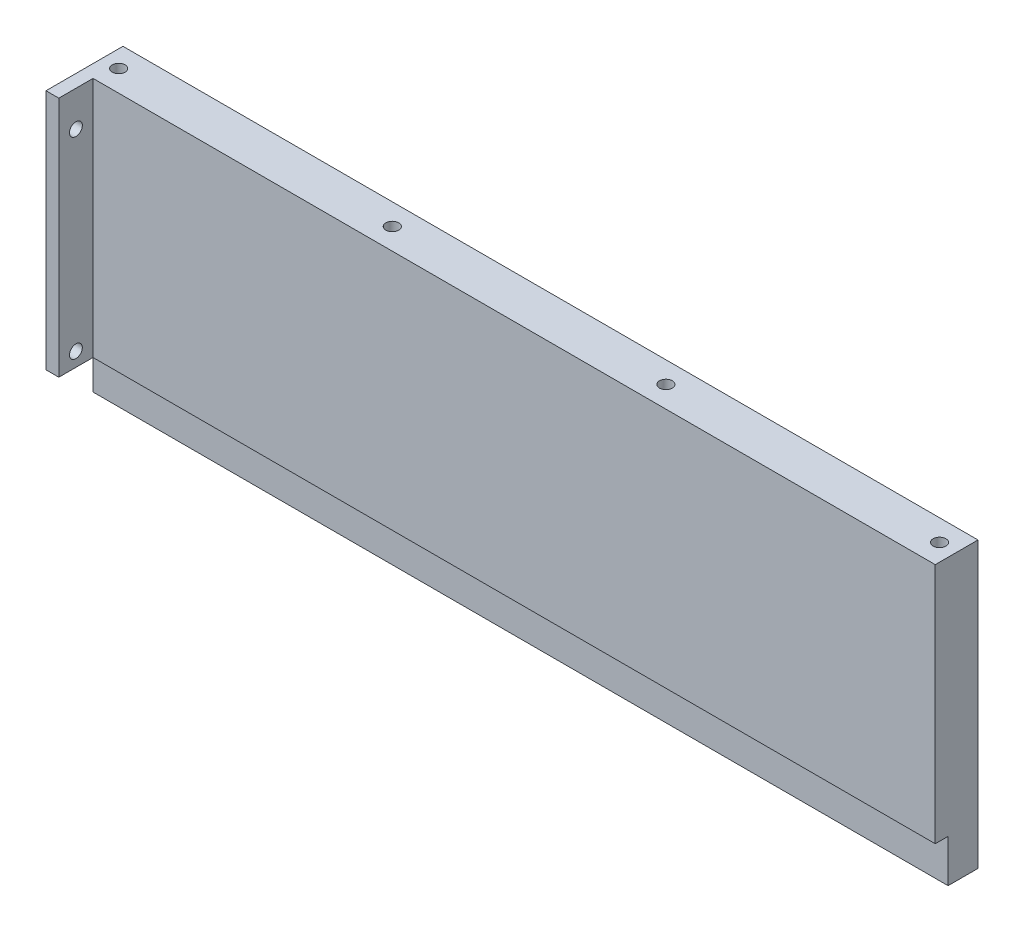
ISO-10303-21;
HEADER;
FILE_DESCRIPTION(('STEP AP214'),'2;1');
FILE_NAME('part.step','',(''),(''),'','','');
FILE_SCHEMA(('AUTOMOTIVE_DESIGN { 1 0 10303 214 1 1 1 1 }'));
ENDSEC;
DATA;
#1=APPLICATION_CONTEXT('core data for automotive mechanical design processes');
#2=APPLICATION_PROTOCOL_DEFINITION('international standard','automotive_design',2000,#1);
#3=PRODUCT_CONTEXT('',#1,'mechanical');
#4=PRODUCT('Part','Part','',(#3));
#5=PRODUCT_RELATED_PRODUCT_CATEGORY('part','',(#4));
#6=PRODUCT_DEFINITION_FORMATION('','',#4);
#7=PRODUCT_DEFINITION_CONTEXT('part definition',#1,'design');
#8=PRODUCT_DEFINITION('design','',#6,#7);
#9=PRODUCT_DEFINITION_SHAPE('','',#8);
#10=(LENGTH_UNIT() NAMED_UNIT(*) SI_UNIT(.MILLI.,.METRE.));
#11=(NAMED_UNIT(*) PLANE_ANGLE_UNIT() SI_UNIT($,.RADIAN.));
#12=(NAMED_UNIT(*) SI_UNIT($,.STERADIAN.) SOLID_ANGLE_UNIT());
#13=UNCERTAINTY_MEASURE_WITH_UNIT(LENGTH_MEASURE(1.E-05),#10,'distance_accuracy_value','');
#14=(GEOMETRIC_REPRESENTATION_CONTEXT(3) GLOBAL_UNCERTAINTY_ASSIGNED_CONTEXT((#13)) GLOBAL_UNIT_ASSIGNED_CONTEXT((#10,
#11,#12)) REPRESENTATION_CONTEXT('',''));
#15=CARTESIAN_POINT('',(0.,0.,0.));
#16=DIRECTION('',(0.,0.,1.));
#17=DIRECTION('',(1.,0.,0.));
#18=AXIS2_PLACEMENT_3D('',#15,#16,#17);
#19=CARTESIAN_POINT('',(-100.,66.54,5.));
#20=DIRECTION('',(0.,0.,-1.));
#21=DIRECTION('',(-1.,0.,0.));
#22=AXIS2_PLACEMENT_3D('',#19,#20,#21);
#23=PLANE('',#22);
#24=DIRECTION('',(0.,1.,0.));
#25=VECTOR('',#24,1.);
#26=CARTESIAN_POINT('',(-97.0000000000001,66.54,5.));
#27=LINE('',#26,#25);
#28=CARTESIAN_POINT('',(-97.0000000000001,10.,5.));
#29=VERTEX_POINT('',#28);
#30=CARTESIAN_POINT('',(-97.0000000000001,66.54,5.));
#31=VERTEX_POINT('',#30);
#32=EDGE_CURVE('E59',#29,#31,#27,.T.);
#33=ORIENTED_EDGE('',*,*,#32,.F.);
#34=DIRECTION('',(-1.,0.,0.));
#35=VECTOR('',#34,1.);
#36=CARTESIAN_POINT('',(-100.,10.,5.));
#37=LINE('',#36,#35);
#38=CARTESIAN_POINT('',(99.9999999999999,10.,5.));
#39=VERTEX_POINT('',#38);
#40=EDGE_CURVE('E156',#39,#29,#37,.T.);
#41=ORIENTED_EDGE('',*,*,#40,.F.);
#42=DIRECTION('',(0.,-1.,0.));
#43=VECTOR('',#42,1.);
#44=CARTESIAN_POINT('',(99.9999999999999,66.54,5.));
#45=LINE('',#44,#43);
#46=CARTESIAN_POINT('',(99.9999999999999,66.54,5.));
#47=VERTEX_POINT('',#46);
#48=EDGE_CURVE('E202',#47,#39,#45,.T.);
#49=ORIENTED_EDGE('',*,*,#48,.F.);
#50=DIRECTION('',(1.,0.,0.));
#51=VECTOR('',#50,1.);
#52=CARTESIAN_POINT('',(-100.,66.54,5.));
#53=LINE('',#52,#51);
#54=EDGE_CURVE('E199',#31,#47,#53,.T.);
#55=ORIENTED_EDGE('',*,*,#54,.F.);
#56=EDGE_LOOP('',(#33,#41,#49,#55));
#57=FACE_BOUND('',#56,.T.);
#58=ADVANCED_FACE('F43',(#57),#23,.F.);
#59=CARTESIAN_POINT('',(95.9999999999999,-0.001000000000001,0.));
#60=DIRECTION('',(0.,1.,0.));
#61=DIRECTION('',(0.,0.,1.));
#62=AXIS2_PLACEMENT_3D('',#59,#60,#61);
#63=CYLINDRICAL_SURFACE('',#62,1.5);
#64=CARTESIAN_POINT('',(95.9999999999999,0.,0.));
#65=DIRECTION('',(0.,-1.,0.));
#66=DIRECTION('',(0.,0.,-1.));
#67=AXIS2_PLACEMENT_3D('',#64,#65,#66);
#68=CIRCLE('',#67,1.5);
#69=CARTESIAN_POINT('',(95.9999999999999,0.,-1.5));
#70=VERTEX_POINT('',#69);
#71=EDGE_CURVE('E52',#70,#70,#68,.F.);
#72=ORIENTED_EDGE('',*,*,#71,.F.);
#73=EDGE_LOOP('',(#72));
#74=FACE_BOUND('',#73,.T.);
#75=CARTESIAN_POINT('',(95.9999999999999,66.54,0.));
#76=DIRECTION('',(0.,1.,0.));
#77=DIRECTION('',(0.,0.,1.));
#78=AXIS2_PLACEMENT_3D('',#75,#76,#77);
#79=CIRCLE('',#78,1.5);
#80=CARTESIAN_POINT('',(95.9999999999999,66.54,1.5));
#81=VERTEX_POINT('',#80);
#82=EDGE_CURVE('E11',#81,#81,#79,.T.);
#83=ORIENTED_EDGE('',*,*,#82,.T.);
#84=EDGE_LOOP('',(#83));
#85=FACE_BOUND('',#84,.T.);
#86=ADVANCED_FACE('F45',(#74,#85),#63,.F.);
#87=CARTESIAN_POINT('',(31.9999999999999,-0.001000000000001,0.));
#88=DIRECTION('',(0.,1.,0.));
#89=DIRECTION('',(0.,0.,1.));
#90=AXIS2_PLACEMENT_3D('',#87,#88,#89);
#91=CYLINDRICAL_SURFACE('',#90,1.5);
#92=CARTESIAN_POINT('',(31.9999999999999,0.,0.));
#93=DIRECTION('',(0.,-1.,0.));
#94=DIRECTION('',(0.,0.,-1.));
#95=AXIS2_PLACEMENT_3D('',#92,#93,#94);
#96=CIRCLE('',#95,1.5);
#97=CARTESIAN_POINT('',(31.9999999999999,0.,-1.5));
#98=VERTEX_POINT('',#97);
#99=EDGE_CURVE('E221',#98,#98,#96,.F.);
#100=ORIENTED_EDGE('',*,*,#99,.F.);
#101=EDGE_LOOP('',(#100));
#102=FACE_BOUND('',#101,.T.);
#103=CARTESIAN_POINT('',(31.9999999999999,66.54,0.));
#104=DIRECTION('',(0.,1.,0.));
#105=DIRECTION('',(0.,0.,1.));
#106=AXIS2_PLACEMENT_3D('',#103,#104,#105);
#107=CIRCLE('',#106,1.5);
#108=CARTESIAN_POINT('',(31.9999999999999,66.54,1.5));
#109=VERTEX_POINT('',#108);
#110=EDGE_CURVE('E225',#109,#109,#107,.T.);
#111=ORIENTED_EDGE('',*,*,#110,.T.);
#112=EDGE_LOOP('',(#111));
#113=FACE_BOUND('',#112,.T.);
#114=ADVANCED_FACE('F236',(#102,#113),#91,.F.);
#115=CARTESIAN_POINT('',(99.9999999999999,66.54,5.));
#116=DIRECTION('',(-1.,0.,0.));
#117=DIRECTION('',(0.,0.,1.));
#118=AXIS2_PLACEMENT_3D('',#115,#116,#117);
#119=PLANE('',#118);
#120=ORIENTED_EDGE('',*,*,#48,.T.);
#121=DIRECTION('',(0.,0.,1.));
#122=VECTOR('',#121,1.);
#123=CARTESIAN_POINT('',(99.9999999999999,10.,2.));
#124=LINE('',#123,#122);
#125=CARTESIAN_POINT('',(99.9999999999999,10.,2.));
#126=VERTEX_POINT('',#125);
#127=EDGE_CURVE('E121',#126,#39,#124,.T.);
#128=ORIENTED_EDGE('',*,*,#127,.F.);
#129=DIRECTION('',(0.,1.,0.));
#130=VECTOR('',#129,1.);
#131=CARTESIAN_POINT('',(99.9999999999999,0.,2.));
#132=LINE('',#131,#130);
#133=CARTESIAN_POINT('',(99.9999999999999,0.,2.));
#134=VERTEX_POINT('',#133);
#135=EDGE_CURVE('E162',#134,#126,#132,.T.);
#136=ORIENTED_EDGE('',*,*,#135,.F.);
#137=DIRECTION('',(0.,0.,-1.));
#138=VECTOR('',#137,1.);
#139=CARTESIAN_POINT('',(99.9999999999999,0.,5.));
#140=LINE('',#139,#138);
#141=CARTESIAN_POINT('',(99.9999999999999,0.,-5.));
#142=VERTEX_POINT('',#141);
#143=EDGE_CURVE('E184',#134,#142,#140,.T.);
#144=ORIENTED_EDGE('',*,*,#143,.T.);
#145=DIRECTION('',(0.,-1.,0.));
#146=VECTOR('',#145,1.);
#147=CARTESIAN_POINT('',(99.9999999999999,66.54,-5.));
#148=LINE('',#147,#146);
#149=CARTESIAN_POINT('',(99.9999999999999,66.54,-5.));
#150=VERTEX_POINT('',#149);
#151=EDGE_CURVE('E217',#150,#142,#148,.T.);
#152=ORIENTED_EDGE('',*,*,#151,.F.);
#153=DIRECTION('',(0.,0.,-1.));
#154=VECTOR('',#153,1.);
#155=CARTESIAN_POINT('',(99.9999999999999,66.54,5.));
#156=LINE('',#155,#154);
#157=EDGE_CURVE('E188',#47,#150,#156,.T.);
#158=ORIENTED_EDGE('',*,*,#157,.F.);
#159=EDGE_LOOP('',(#120,#128,#136,#144,#152,#158));
#160=FACE_BOUND('',#159,.T.);
#161=ADVANCED_FACE('F263',(#160),#119,.F.);
#162=CARTESIAN_POINT('',(-100.,66.54,-5.));
#163=DIRECTION('',(0.,0.,1.));
#164=DIRECTION('',(1.,0.,0.));
#165=AXIS2_PLACEMENT_3D('',#162,#163,#164);
#166=PLANE('',#165);
#167=DIRECTION('',(-1.,0.,0.));
#168=VECTOR('',#167,1.);
#169=CARTESIAN_POINT('',(-100.,0.,-5.));
#170=LINE('',#169,#168);
#171=CARTESIAN_POINT('',(-100.,0.,-5.));
#172=VERTEX_POINT('',#171);
#173=EDGE_CURVE('E205',#142,#172,#170,.T.);
#174=ORIENTED_EDGE('',*,*,#173,.T.);
#175=DIRECTION('',(0.,-1.,0.));
#176=VECTOR('',#175,1.);
#177=CARTESIAN_POINT('',(-100.,66.54,-5.));
#178=LINE('',#177,#176);
#179=CARTESIAN_POINT('',(-100.,66.54,-5.));
#180=VERTEX_POINT('',#179);
#181=EDGE_CURVE('E213',#180,#172,#178,.T.);
#182=ORIENTED_EDGE('',*,*,#181,.F.);
#183=DIRECTION('',(-1.,0.,0.));
#184=VECTOR('',#183,1.);
#185=CARTESIAN_POINT('',(-100.,66.54,-5.));
#186=LINE('',#185,#184);
#187=EDGE_CURVE('E192',#150,#180,#186,.T.);
#188=ORIENTED_EDGE('',*,*,#187,.F.);
#189=ORIENTED_EDGE('',*,*,#151,.T.);
#190=EDGE_LOOP('',(#174,#182,#188,#189));
#191=FACE_BOUND('',#190,.T.);
#192=ADVANCED_FACE('F250',(#191),#166,.F.);
#193=CARTESIAN_POINT('',(-100.,66.54,5.));
#194=DIRECTION('',(1.,0.,0.));
#195=DIRECTION('',(0.,0.,-1.));
#196=AXIS2_PLACEMENT_3D('',#193,#194,#195);
#197=PLANE('',#196);
#198=CARTESIAN_POINT('',(-100.,58.27,9.));
#199=DIRECTION('',(-1.,0.,0.));
#200=DIRECTION('',(0.,0.,1.));
#201=AXIS2_PLACEMENT_3D('',#198,#199,#200);
#202=CIRCLE('',#201,1.5);
#203=CARTESIAN_POINT('',(-100.,58.27,10.5));
#204=VERTEX_POINT('',#203);
#205=EDGE_CURVE('E454',#204,#204,#202,.T.);
#206=ORIENTED_EDGE('',*,*,#205,.F.);
#207=EDGE_LOOP('',(#206));
#208=FACE_BOUND('',#207,.T.);
#209=CARTESIAN_POINT('',(-100.,13.27,9.));
#210=DIRECTION('',(-1.,0.,0.));
#211=DIRECTION('',(0.,0.,1.));
#212=AXIS2_PLACEMENT_3D('',#209,#210,#211);
#213=CIRCLE('',#212,1.5);
#214=CARTESIAN_POINT('',(-100.,13.27,10.5));
#215=VERTEX_POINT('',#214);
#216=EDGE_CURVE('E143',#215,#215,#213,.T.);
#217=ORIENTED_EDGE('',*,*,#216,.F.);
#218=EDGE_LOOP('',(#217));
#219=FACE_BOUND('',#218,.T.);
#220=DIRECTION('',(0.,-1.,0.));
#221=VECTOR('',#220,1.);
#222=CARTESIAN_POINT('',(-100.,0.,2.));
#223=LINE('',#222,#221);
#224=CARTESIAN_POINT('',(-100.,10.,2.));
#225=VERTEX_POINT('',#224);
#226=CARTESIAN_POINT('',(-100.,0.,2.));
#227=VERTEX_POINT('',#226);
#228=EDGE_CURVE('E67',#225,#227,#223,.T.);
#229=ORIENTED_EDGE('',*,*,#228,.F.);
#230=DIRECTION('',(0.,0.,1.));
#231=VECTOR('',#230,1.);
#232=CARTESIAN_POINT('',(-100.,10.,2.));
#233=LINE('',#232,#231);
#234=CARTESIAN_POINT('',(-100.,10.,13.));
#235=VERTEX_POINT('',#234);
#236=EDGE_CURVE('E110',#225,#235,#233,.T.);
#237=ORIENTED_EDGE('',*,*,#236,.T.);
#238=DIRECTION('',(0.,-1.,0.));
#239=VECTOR('',#238,1.);
#240=CARTESIAN_POINT('',(-100.,66.54,13.));
#241=LINE('',#240,#239);
#242=CARTESIAN_POINT('',(-100.,66.54,13.));
#243=VERTEX_POINT('',#242);
#244=EDGE_CURVE('E115',#243,#235,#241,.T.);
#245=ORIENTED_EDGE('',*,*,#244,.F.);
#246=DIRECTION('',(0.,0.,1.));
#247=VECTOR('',#246,1.);
#248=CARTESIAN_POINT('',(-100.,66.54,5.));
#249=LINE('',#248,#247);
#250=EDGE_CURVE('E196',#180,#243,#249,.T.);
#251=ORIENTED_EDGE('',*,*,#250,.F.);
#252=ORIENTED_EDGE('',*,*,#181,.T.);
#253=DIRECTION('',(0.,0.,1.));
#254=VECTOR('',#253,1.);
#255=CARTESIAN_POINT('',(-100.,0.,5.));
#256=LINE('',#255,#254);
#257=EDGE_CURVE('E193',#172,#227,#256,.T.);
#258=ORIENTED_EDGE('',*,*,#257,.T.);
#259=EDGE_LOOP('',(#229,#237,#245,#251,#252,#258));
#260=FACE_BOUND('',#259,.T.);
#261=ADVANCED_FACE('F112',(#208,#219,#260),#197,.F.);
#262=CARTESIAN_POINT('',(0.,66.54,0.));
#263=DIRECTION('',(0.,-1.,0.));
#264=DIRECTION('',(0.,0.,-1.));
#265=AXIS2_PLACEMENT_3D('',#262,#263,#264);
#266=PLANE('',#265);
#267=CARTESIAN_POINT('',(-32.0000000000001,66.54,0.));
#268=DIRECTION('',(0.,1.,0.));
#269=DIRECTION('',(0.,0.,1.));
#270=AXIS2_PLACEMENT_3D('',#267,#268,#269);
#271=CIRCLE('',#270,1.5);
#272=CARTESIAN_POINT('',(-32.0000000000001,66.54,1.5));
#273=VERTEX_POINT('',#272);
#274=EDGE_CURVE('E175',#273,#273,#271,.T.);
#275=ORIENTED_EDGE('',*,*,#274,.F.);
#276=EDGE_LOOP('',(#275));
#277=FACE_BOUND('',#276,.T.);
#278=CARTESIAN_POINT('',(-96.0000000000001,66.54,0.));
#279=DIRECTION('',(0.,1.,0.));
#280=DIRECTION('',(0.,0.,1.));
#281=AXIS2_PLACEMENT_3D('',#278,#279,#280);
#282=CIRCLE('',#281,1.5);
#283=CARTESIAN_POINT('',(-96.0000000000001,66.54,1.5));
#284=VERTEX_POINT('',#283);
#285=EDGE_CURVE('E180',#284,#284,#282,.T.);
#286=ORIENTED_EDGE('',*,*,#285,.F.);
#287=EDGE_LOOP('',(#286));
#288=FACE_BOUND('',#287,.T.);
#289=ORIENTED_EDGE('',*,*,#157,.T.);
#290=ORIENTED_EDGE('',*,*,#187,.T.);
#291=ORIENTED_EDGE('',*,*,#250,.T.);
#292=DIRECTION('',(-1.,0.,0.));
#293=VECTOR('',#292,1.);
#294=CARTESIAN_POINT('',(-100.,66.54,13.));
#295=LINE('',#294,#293);
#296=CARTESIAN_POINT('',(-97.0000000000001,66.54,13.));
#297=VERTEX_POINT('',#296);
#298=EDGE_CURVE('E136',#297,#243,#295,.T.);
#299=ORIENTED_EDGE('',*,*,#298,.F.);
#300=DIRECTION('',(0.,0.,-1.));
#301=VECTOR('',#300,1.);
#302=CARTESIAN_POINT('',(-97.0000000000001,66.54,13.));
#303=LINE('',#302,#301);
#304=EDGE_CURVE('E149',#297,#31,#303,.T.);
#305=ORIENTED_EDGE('',*,*,#304,.T.);
#306=ORIENTED_EDGE('',*,*,#54,.T.);
#307=EDGE_LOOP('',(#289,#290,#291,#299,#305,#306));
#308=FACE_BOUND('',#307,.T.);
#309=ORIENTED_EDGE('',*,*,#110,.F.);
#310=EDGE_LOOP('',(#309));
#311=FACE_BOUND('',#310,.T.);
#312=ORIENTED_EDGE('',*,*,#82,.F.);
#313=EDGE_LOOP('',(#312));
#314=FACE_BOUND('',#313,.T.);
#315=ADVANCED_FACE('F239',(#277,#288,#308,#311,#314),#266,.F.);
#316=CARTESIAN_POINT('',(0.,0.,0.));
#317=DIRECTION('',(0.,-1.,0.));
#318=DIRECTION('',(0.,0.,-1.));
#319=AXIS2_PLACEMENT_3D('',#316,#317,#318);
#320=PLANE('',#319);
#321=DIRECTION('',(1.,0.,0.));
#322=VECTOR('',#321,1.);
#323=CARTESIAN_POINT('',(-100.,0.,2.));
#324=LINE('',#323,#322);
#325=EDGE_CURVE('E159',#227,#134,#324,.T.);
#326=ORIENTED_EDGE('',*,*,#325,.F.);
#327=ORIENTED_EDGE('',*,*,#257,.F.);
#328=ORIENTED_EDGE('',*,*,#173,.F.);
#329=ORIENTED_EDGE('',*,*,#143,.F.);
#330=EDGE_LOOP('',(#326,#327,#328,#329));
#331=FACE_BOUND('',#330,.T.);
#332=CARTESIAN_POINT('',(-32.0000000000001,0.,0.));
#333=DIRECTION('',(0.,-1.,0.));
#334=DIRECTION('',(0.,0.,-1.));
#335=AXIS2_PLACEMENT_3D('',#332,#333,#334);
#336=CIRCLE('',#335,1.5);
#337=CARTESIAN_POINT('',(-32.0000000000001,0.,-1.5));
#338=VERTEX_POINT('',#337);
#339=EDGE_CURVE('E120',#338,#338,#336,.F.);
#340=ORIENTED_EDGE('',*,*,#339,.T.);
#341=EDGE_LOOP('',(#340));
#342=FACE_BOUND('',#341,.T.);
#343=CARTESIAN_POINT('',(-96.0000000000001,0.,0.));
#344=DIRECTION('',(0.,-1.,0.));
#345=DIRECTION('',(0.,0.,-1.));
#346=AXIS2_PLACEMENT_3D('',#343,#344,#345);
#347=CIRCLE('',#346,1.5);
#348=CARTESIAN_POINT('',(-96.0000000000001,0.,-1.5));
#349=VERTEX_POINT('',#348);
#350=EDGE_CURVE('E179',#349,#349,#347,.F.);
#351=ORIENTED_EDGE('',*,*,#350,.T.);
#352=EDGE_LOOP('',(#351));
#353=FACE_BOUND('',#352,.T.);
#354=ORIENTED_EDGE('',*,*,#99,.T.);
#355=EDGE_LOOP('',(#354));
#356=FACE_BOUND('',#355,.T.);
#357=ORIENTED_EDGE('',*,*,#71,.T.);
#358=EDGE_LOOP('',(#357));
#359=FACE_BOUND('',#358,.T.);
#360=ADVANCED_FACE('F232',(#331,#342,#353,#356,#359),#320,.T.);
#361=CARTESIAN_POINT('',(-96.0000000000001,-0.001000000000001,0.));
#362=DIRECTION('',(0.,1.,0.));
#363=DIRECTION('',(0.,0.,1.));
#364=AXIS2_PLACEMENT_3D('',#361,#362,#363);
#365=CYLINDRICAL_SURFACE('',#364,1.5);
#366=ORIENTED_EDGE('',*,*,#350,.F.);
#367=EDGE_LOOP('',(#366));
#368=FACE_BOUND('',#367,.T.);
#369=ORIENTED_EDGE('',*,*,#285,.T.);
#370=EDGE_LOOP('',(#369));
#371=FACE_BOUND('',#370,.T.);
#372=ADVANCED_FACE('F247',(#368,#371),#365,.F.);
#373=CARTESIAN_POINT('',(-32.0000000000001,-0.001000000000001,0.));
#374=DIRECTION('',(0.,1.,0.));
#375=DIRECTION('',(0.,0.,1.));
#376=AXIS2_PLACEMENT_3D('',#373,#374,#375);
#377=CYLINDRICAL_SURFACE('',#376,1.5);
#378=ORIENTED_EDGE('',*,*,#339,.F.);
#379=EDGE_LOOP('',(#378));
#380=FACE_BOUND('',#379,.T.);
#381=ORIENTED_EDGE('',*,*,#274,.T.);
#382=EDGE_LOOP('',(#381));
#383=FACE_BOUND('',#382,.T.);
#384=ADVANCED_FACE('F366',(#380,#383),#377,.F.);
#385=CARTESIAN_POINT('',(-100.,10.,2.));
#386=DIRECTION('',(0.,1.,0.));
#387=DIRECTION('',(-1.,0.,0.));
#388=AXIS2_PLACEMENT_3D('',#385,#386,#387);
#389=PLANE('',#388);
#390=ORIENTED_EDGE('',*,*,#40,.T.);
#391=DIRECTION('',(0.,0.,-1.));
#392=VECTOR('',#391,1.);
#393=CARTESIAN_POINT('',(-97.0000000000001,10.,13.));
#394=LINE('',#393,#392);
#395=CARTESIAN_POINT('',(-97.0000000000001,10.,13.));
#396=VERTEX_POINT('',#395);
#397=EDGE_CURVE('E127',#396,#29,#394,.T.);
#398=ORIENTED_EDGE('',*,*,#397,.F.);
#399=DIRECTION('',(1.,0.,0.));
#400=VECTOR('',#399,1.);
#401=CARTESIAN_POINT('',(-100.,10.,13.));
#402=LINE('',#401,#400);
#403=EDGE_CURVE('E124',#235,#396,#402,.T.);
#404=ORIENTED_EDGE('',*,*,#403,.F.);
#405=ORIENTED_EDGE('',*,*,#236,.F.);
#406=DIRECTION('',(-1.,0.,0.));
#407=VECTOR('',#406,1.);
#408=CARTESIAN_POINT('',(-100.,10.,2.));
#409=LINE('',#408,#407);
#410=EDGE_CURVE('E165',#126,#225,#409,.T.);
#411=ORIENTED_EDGE('',*,*,#410,.F.);
#412=ORIENTED_EDGE('',*,*,#127,.T.);
#413=EDGE_LOOP('',(#390,#398,#404,#405,#411,#412));
#414=FACE_BOUND('',#413,.T.);
#415=ADVANCED_FACE('F125',(#414),#389,.F.);
#416=CARTESIAN_POINT('',(0.,0.,2.));
#417=DIRECTION('',(0.,0.,-1.));
#418=DIRECTION('',(-1.,0.,0.));
#419=AXIS2_PLACEMENT_3D('',#416,#417,#418);
#420=PLANE('',#419);
#421=ORIENTED_EDGE('',*,*,#228,.T.);
#422=ORIENTED_EDGE('',*,*,#325,.T.);
#423=ORIENTED_EDGE('',*,*,#135,.T.);
#424=ORIENTED_EDGE('',*,*,#410,.T.);
#425=EDGE_LOOP('',(#421,#422,#423,#424));
#426=FACE_BOUND('',#425,.T.);
#427=ADVANCED_FACE('F311',(#426),#420,.F.);
#428=CARTESIAN_POINT('',(-97.0000000000001,66.54,13.));
#429=DIRECTION('',(-1.,0.,0.));
#430=DIRECTION('',(0.,0.,1.));
#431=AXIS2_PLACEMENT_3D('',#428,#429,#430);
#432=PLANE('',#431);
#433=CARTESIAN_POINT('',(-97.0000000000001,58.27,9.));
#434=DIRECTION('',(-1.,0.,0.));
#435=DIRECTION('',(0.,0.,1.));
#436=AXIS2_PLACEMENT_3D('',#433,#434,#435);
#437=CIRCLE('',#436,1.5);
#438=CARTESIAN_POINT('',(-97.0000000000001,58.27,10.5));
#439=VERTEX_POINT('',#438);
#440=EDGE_CURVE('E140',#439,#439,#437,.F.);
#441=ORIENTED_EDGE('',*,*,#440,.F.);
#442=EDGE_LOOP('',(#441));
#443=FACE_BOUND('',#442,.T.);
#444=CARTESIAN_POINT('',(-97.0000000000001,13.27,9.));
#445=DIRECTION('',(-1.,0.,0.));
#446=DIRECTION('',(0.,0.,1.));
#447=AXIS2_PLACEMENT_3D('',#444,#445,#446);
#448=CIRCLE('',#447,1.5);
#449=CARTESIAN_POINT('',(-97.0000000000001,13.27,10.5));
#450=VERTEX_POINT('',#449);
#451=EDGE_CURVE('E461',#450,#450,#448,.F.);
#452=ORIENTED_EDGE('',*,*,#451,.F.);
#453=EDGE_LOOP('',(#452));
#454=FACE_BOUND('',#453,.T.);
#455=ORIENTED_EDGE('',*,*,#32,.T.);
#456=ORIENTED_EDGE('',*,*,#304,.F.);
#457=DIRECTION('',(0.,1.,0.));
#458=VECTOR('',#457,1.);
#459=CARTESIAN_POINT('',(-97.0000000000001,66.54,13.));
#460=LINE('',#459,#458);
#461=EDGE_CURVE('E131',#396,#297,#460,.T.);
#462=ORIENTED_EDGE('',*,*,#461,.F.);
#463=ORIENTED_EDGE('',*,*,#397,.T.);
#464=EDGE_LOOP('',(#455,#456,#462,#463));
#465=FACE_BOUND('',#464,.T.);
#466=ADVANCED_FACE('F306',(#443,#454,#465),#432,.F.);
#467=CARTESIAN_POINT('',(0.,0.,13.));
#468=DIRECTION('',(0.,0.,1.));
#469=DIRECTION('',(1.,0.,0.));
#470=AXIS2_PLACEMENT_3D('',#467,#468,#469);
#471=PLANE('',#470);
#472=ORIENTED_EDGE('',*,*,#244,.T.);
#473=ORIENTED_EDGE('',*,*,#403,.T.);
#474=ORIENTED_EDGE('',*,*,#461,.T.);
#475=ORIENTED_EDGE('',*,*,#298,.T.);
#476=EDGE_LOOP('',(#472,#473,#474,#475));
#477=FACE_BOUND('',#476,.T.);
#478=ADVANCED_FACE('F134',(#477),#471,.T.);
#479=CARTESIAN_POINT('',(100.001,13.27,9.));
#480=DIRECTION('',(-1.,0.,0.));
#481=DIRECTION('',(0.,0.,1.));
#482=AXIS2_PLACEMENT_3D('',#479,#480,#481);
#483=CYLINDRICAL_SURFACE('',#482,1.5);
#484=CARTESIAN_POINT('',(-100.,13.27,10.5));
#485=CARTESIAN_POINT('',(-99.9687500000001,13.27,10.5));
#486=CARTESIAN_POINT('',(-99.9375000000001,13.27,10.5));
#487=CARTESIAN_POINT('',(-99.8750000000001,13.27,10.5));
#488=CARTESIAN_POINT('',(-99.8437500000001,13.27,10.5));
#489=CARTESIAN_POINT('',(-99.7812500000001,13.27,10.5));
#490=CARTESIAN_POINT('',(-99.7500000000001,13.27,10.5));
#491=CARTESIAN_POINT('',(-99.6875000000001,13.27,10.5));
#492=CARTESIAN_POINT('',(-99.6562500000001,13.27,10.5));
#493=CARTESIAN_POINT('',(-99.5937500000001,13.27,10.5));
#494=CARTESIAN_POINT('',(-99.5625000000001,13.27,10.5));
#495=CARTESIAN_POINT('',(-99.5000000000001,13.27,10.5));
#496=CARTESIAN_POINT('',(-99.4687500000001,13.27,10.5));
#497=CARTESIAN_POINT('',(-99.4062500000001,13.27,10.5));
#498=CARTESIAN_POINT('',(-99.3750000000001,13.27,10.5));
#499=CARTESIAN_POINT('',(-99.3125000000001,13.27,10.5));
#500=CARTESIAN_POINT('',(-99.2812500000001,13.27,10.5));
#501=CARTESIAN_POINT('',(-99.2187500000001,13.27,10.5));
#502=CARTESIAN_POINT('',(-99.1875000000001,13.27,10.5));
#503=CARTESIAN_POINT('',(-99.1250000000001,13.27,10.5));
#504=CARTESIAN_POINT('',(-99.0937500000001,13.27,10.5));
#505=CARTESIAN_POINT('',(-99.0312500000001,13.27,10.5));
#506=CARTESIAN_POINT('',(-99.0000000000001,13.27,10.5));
#507=CARTESIAN_POINT('',(-98.9375000000001,13.27,10.5));
#508=CARTESIAN_POINT('',(-98.9062500000001,13.27,10.5));
#509=CARTESIAN_POINT('',(-98.8437500000001,13.27,10.5));
#510=CARTESIAN_POINT('',(-98.8125000000001,13.27,10.5));
#511=CARTESIAN_POINT('',(-98.7500000000001,13.27,10.5));
#512=CARTESIAN_POINT('',(-98.7187500000001,13.27,10.5));
#513=CARTESIAN_POINT('',(-98.6562500000001,13.27,10.5));
#514=CARTESIAN_POINT('',(-98.6250000000001,13.27,10.5));
#515=CARTESIAN_POINT('',(-98.5625000000001,13.27,10.5));
#516=CARTESIAN_POINT('',(-98.5312500000001,13.27,10.5));
#517=CARTESIAN_POINT('',(-98.4687500000001,13.27,10.5));
#518=CARTESIAN_POINT('',(-98.4375000000001,13.27,10.5));
#519=CARTESIAN_POINT('',(-98.3750000000001,13.27,10.5));
#520=CARTESIAN_POINT('',(-98.3437500000001,13.27,10.5));
#521=CARTESIAN_POINT('',(-98.2812500000001,13.27,10.5));
#522=CARTESIAN_POINT('',(-98.2500000000001,13.27,10.5));
#523=CARTESIAN_POINT('',(-98.1875000000001,13.27,10.5));
#524=CARTESIAN_POINT('',(-98.1562500000001,13.27,10.5));
#525=CARTESIAN_POINT('',(-98.0937500000001,13.27,10.5));
#526=CARTESIAN_POINT('',(-98.0625000000001,13.27,10.5));
#527=CARTESIAN_POINT('',(-98.0000000000001,13.27,10.5));
#528=CARTESIAN_POINT('',(-97.9687500000001,13.27,10.5));
#529=CARTESIAN_POINT('',(-97.9062500000001,13.27,10.5));
#530=CARTESIAN_POINT('',(-97.8750000000001,13.27,10.5));
#531=CARTESIAN_POINT('',(-97.8125000000001,13.27,10.5));
#532=CARTESIAN_POINT('',(-97.7812500000001,13.27,10.5));
#533=CARTESIAN_POINT('',(-97.7187500000001,13.27,10.5));
#534=CARTESIAN_POINT('',(-97.6875000000001,13.27,10.5));
#535=CARTESIAN_POINT('',(-97.6250000000001,13.27,10.5));
#536=CARTESIAN_POINT('',(-97.5937500000001,13.27,10.5));
#537=CARTESIAN_POINT('',(-97.5312500000001,13.27,10.5));
#538=CARTESIAN_POINT('',(-97.5000000000001,13.27,10.5));
#539=CARTESIAN_POINT('',(-97.4375000000001,13.27,10.5));
#540=CARTESIAN_POINT('',(-97.4062500000001,13.27,10.5));
#541=CARTESIAN_POINT('',(-97.3437500000001,13.27,10.5));
#542=CARTESIAN_POINT('',(-97.3125000000001,13.27,10.5));
#543=CARTESIAN_POINT('',(-97.2500000000001,13.27,10.5));
#544=CARTESIAN_POINT('',(-97.2187500000001,13.27,10.5));
#545=CARTESIAN_POINT('',(-97.1562500000001,13.27,10.5));
#546=CARTESIAN_POINT('',(-97.1250000000001,13.27,10.5));
#547=CARTESIAN_POINT('',(-97.0625000000001,13.27,10.5));
#548=CARTESIAN_POINT('',(-97.0312500000001,13.27,10.5));
#549=CARTESIAN_POINT('',(-97.0000000000001,13.27,10.5));
#550=B_SPLINE_CURVE_WITH_KNOTS('',3,(#484,#485,#486,#487,#488,#489,#490,#491,#492,#493,#494,
#495,#496,#497,#498,#499,#500,#501,#502,#503,#504,#505,#506,#507,#508,#509,#510,#511,#512,#513,
#514,#515,#516,#517,#518,#519,#520,#521,#522,#523,#524,#525,#526,#527,#528,#529,#530,#531,#532,
#533,#534,#535,#536,#537,#538,#539,#540,#541,#542,#543,#544,#545,#546,#547,#548,#549),
.UNSPECIFIED.,.F.,.F.,(4,2,2,2,2,2,2,2,2,2,2,2,2,2,2,2,2,2,2,2,2,2,2,2,2,2,2,2,2,2,2,2,4),(0.,
0.0937500000000036,0.187500000000007,0.281250000000011,0.375000000000014,0.46874999999999,
0.562499999999994,0.656249999999997,0.750000000000001,0.843750000000004,0.937500000000008,
1.03125000000001,1.12499999999999,1.21874999999999,1.31249999999999,1.40625,1.5,1.59375,
1.68750000000001,1.78125000000001,1.87500000000002,1.96874999999999,2.06249999999999,2.15625,
2.25,2.34375000000001,2.43750000000001,2.53125000000001,2.62499999999999,2.71874999999999,
2.8125,2.90625,3.),.UNSPECIFIED.);
#551=EDGE_CURVE('BSEAM320',#215,#450,#550,.T.);
#552=ORIENTED_EDGE('',*,*,#216,.T.);
#553=ORIENTED_EDGE('',*,*,#451,.T.);
#554=ORIENTED_EDGE('',*,*,#551,.T.);
#555=ORIENTED_EDGE('',*,*,#551,.F.);
#556=EDGE_LOOP('',(#552,#554,#553,#555));
#557=FACE_BOUND('',#556,.T.);
#558=ADVANCED_FACE('F320',(#557),#483,.F.);
#559=CARTESIAN_POINT('',(100.001,58.27,9.));
#560=DIRECTION('',(-1.,0.,0.));
#561=DIRECTION('',(0.,0.,1.));
#562=AXIS2_PLACEMENT_3D('',#559,#560,#561);
#563=CYLINDRICAL_SURFACE('',#562,1.5);
#564=CARTESIAN_POINT('',(-100.,58.27,10.5));
#565=CARTESIAN_POINT('',(-99.9687500000001,58.27,10.5));
#566=CARTESIAN_POINT('',(-99.9375000000001,58.27,10.5));
#567=CARTESIAN_POINT('',(-99.8750000000001,58.27,10.5));
#568=CARTESIAN_POINT('',(-99.8437500000001,58.27,10.5));
#569=CARTESIAN_POINT('',(-99.7812500000001,58.27,10.5));
#570=CARTESIAN_POINT('',(-99.7500000000001,58.27,10.5));
#571=CARTESIAN_POINT('',(-99.6875000000001,58.27,10.5));
#572=CARTESIAN_POINT('',(-99.6562500000001,58.27,10.5));
#573=CARTESIAN_POINT('',(-99.5937500000001,58.27,10.5));
#574=CARTESIAN_POINT('',(-99.5625000000001,58.27,10.5));
#575=CARTESIAN_POINT('',(-99.5000000000001,58.27,10.5));
#576=CARTESIAN_POINT('',(-99.4687500000001,58.27,10.5));
#577=CARTESIAN_POINT('',(-99.4062500000001,58.27,10.5));
#578=CARTESIAN_POINT('',(-99.3750000000001,58.27,10.5));
#579=CARTESIAN_POINT('',(-99.3125000000001,58.27,10.5));
#580=CARTESIAN_POINT('',(-99.2812500000001,58.27,10.5));
#581=CARTESIAN_POINT('',(-99.2187500000001,58.27,10.5));
#582=CARTESIAN_POINT('',(-99.1875000000001,58.27,10.5));
#583=CARTESIAN_POINT('',(-99.1250000000001,58.27,10.5));
#584=CARTESIAN_POINT('',(-99.0937500000001,58.27,10.5));
#585=CARTESIAN_POINT('',(-99.0312500000001,58.27,10.5));
#586=CARTESIAN_POINT('',(-99.0000000000001,58.27,10.5));
#587=CARTESIAN_POINT('',(-98.9375000000001,58.27,10.5));
#588=CARTESIAN_POINT('',(-98.9062500000001,58.27,10.5));
#589=CARTESIAN_POINT('',(-98.8437500000001,58.27,10.5));
#590=CARTESIAN_POINT('',(-98.8125000000001,58.27,10.5));
#591=CARTESIAN_POINT('',(-98.7500000000001,58.27,10.5));
#592=CARTESIAN_POINT('',(-98.7187500000001,58.27,10.5));
#593=CARTESIAN_POINT('',(-98.6562500000001,58.27,10.5));
#594=CARTESIAN_POINT('',(-98.6250000000001,58.27,10.5));
#595=CARTESIAN_POINT('',(-98.5625000000001,58.27,10.5));
#596=CARTESIAN_POINT('',(-98.5312500000001,58.27,10.5));
#597=CARTESIAN_POINT('',(-98.4687500000001,58.27,10.5));
#598=CARTESIAN_POINT('',(-98.4375000000001,58.27,10.5));
#599=CARTESIAN_POINT('',(-98.3750000000001,58.27,10.5));
#600=CARTESIAN_POINT('',(-98.3437500000001,58.27,10.5));
#601=CARTESIAN_POINT('',(-98.2812500000001,58.27,10.5));
#602=CARTESIAN_POINT('',(-98.2500000000001,58.27,10.5));
#603=CARTESIAN_POINT('',(-98.1875000000001,58.27,10.5));
#604=CARTESIAN_POINT('',(-98.1562500000001,58.27,10.5));
#605=CARTESIAN_POINT('',(-98.0937500000001,58.27,10.5));
#606=CARTESIAN_POINT('',(-98.0625000000001,58.27,10.5));
#607=CARTESIAN_POINT('',(-98.0000000000001,58.27,10.5));
#608=CARTESIAN_POINT('',(-97.9687500000001,58.27,10.5));
#609=CARTESIAN_POINT('',(-97.9062500000001,58.27,10.5));
#610=CARTESIAN_POINT('',(-97.8750000000001,58.27,10.5));
#611=CARTESIAN_POINT('',(-97.8125000000001,58.27,10.5));
#612=CARTESIAN_POINT('',(-97.7812500000001,58.27,10.5));
#613=CARTESIAN_POINT('',(-97.7187500000001,58.27,10.5));
#614=CARTESIAN_POINT('',(-97.6875000000001,58.27,10.5));
#615=CARTESIAN_POINT('',(-97.6250000000001,58.27,10.5));
#616=CARTESIAN_POINT('',(-97.5937500000001,58.27,10.5));
#617=CARTESIAN_POINT('',(-97.5312500000001,58.27,10.5));
#618=CARTESIAN_POINT('',(-97.5000000000001,58.27,10.5));
#619=CARTESIAN_POINT('',(-97.4375000000001,58.27,10.5));
#620=CARTESIAN_POINT('',(-97.4062500000001,58.27,10.5));
#621=CARTESIAN_POINT('',(-97.3437500000001,58.27,10.5));
#622=CARTESIAN_POINT('',(-97.3125000000001,58.27,10.5));
#623=CARTESIAN_POINT('',(-97.2500000000001,58.27,10.5));
#624=CARTESIAN_POINT('',(-97.2187500000001,58.27,10.5));
#625=CARTESIAN_POINT('',(-97.1562500000001,58.27,10.5));
#626=CARTESIAN_POINT('',(-97.1250000000001,58.27,10.5));
#627=CARTESIAN_POINT('',(-97.0625000000001,58.27,10.5));
#628=CARTESIAN_POINT('',(-97.0312500000001,58.27,10.5));
#629=CARTESIAN_POINT('',(-97.0000000000001,58.27,10.5));
#630=B_SPLINE_CURVE_WITH_KNOTS('',3,(#564,#565,#566,#567,#568,#569,#570,#571,#572,#573,#574,
#575,#576,#577,#578,#579,#580,#581,#582,#583,#584,#585,#586,#587,#588,#589,#590,#591,#592,#593,
#594,#595,#596,#597,#598,#599,#600,#601,#602,#603,#604,#605,#606,#607,#608,#609,#610,#611,#612,
#613,#614,#615,#616,#617,#618,#619,#620,#621,#622,#623,#624,#625,#626,#627,#628,#629),
.UNSPECIFIED.,.F.,.F.,(4,2,2,2,2,2,2,2,2,2,2,2,2,2,2,2,2,2,2,2,2,2,2,2,2,2,2,2,2,2,2,2,4),(0.,
0.0937500000000036,0.187500000000007,0.281250000000011,0.375000000000014,0.46874999999999,
0.562499999999994,0.656249999999997,0.750000000000001,0.843750000000004,0.937500000000008,
1.03125000000001,1.12499999999999,1.21874999999999,1.31249999999999,1.40625,1.5,1.59375,
1.68750000000001,1.78125000000001,1.87500000000002,1.96874999999999,2.06249999999999,2.15625,
2.25,2.34375000000001,2.43750000000001,2.53125000000001,2.62499999999999,2.71874999999999,
2.8125,2.90625,3.),.UNSPECIFIED.);
#631=EDGE_CURVE('BSEAM325',#204,#439,#630,.T.);
#632=ORIENTED_EDGE('',*,*,#205,.T.);
#633=ORIENTED_EDGE('',*,*,#440,.T.);
#634=ORIENTED_EDGE('',*,*,#631,.T.);
#635=ORIENTED_EDGE('',*,*,#631,.F.);
#636=EDGE_LOOP('',(#632,#634,#633,#635));
#637=FACE_BOUND('',#636,.T.);
#638=ADVANCED_FACE('F325',(#637),#563,.F.);
#639=CLOSED_SHELL('',(#58,#86,#114,#161,#192,#261,#315,#360,#372,#384,#415,#427,#466,#478,#558,#638));
#640=MANIFOLD_SOLID_BREP('B2',#639);
#641=ADVANCED_BREP_SHAPE_REPRESENTATION('',(#18,#640),#14);
#642=SHAPE_DEFINITION_REPRESENTATION(#9,#641);
ENDSEC;
END-ISO-10303-21;
